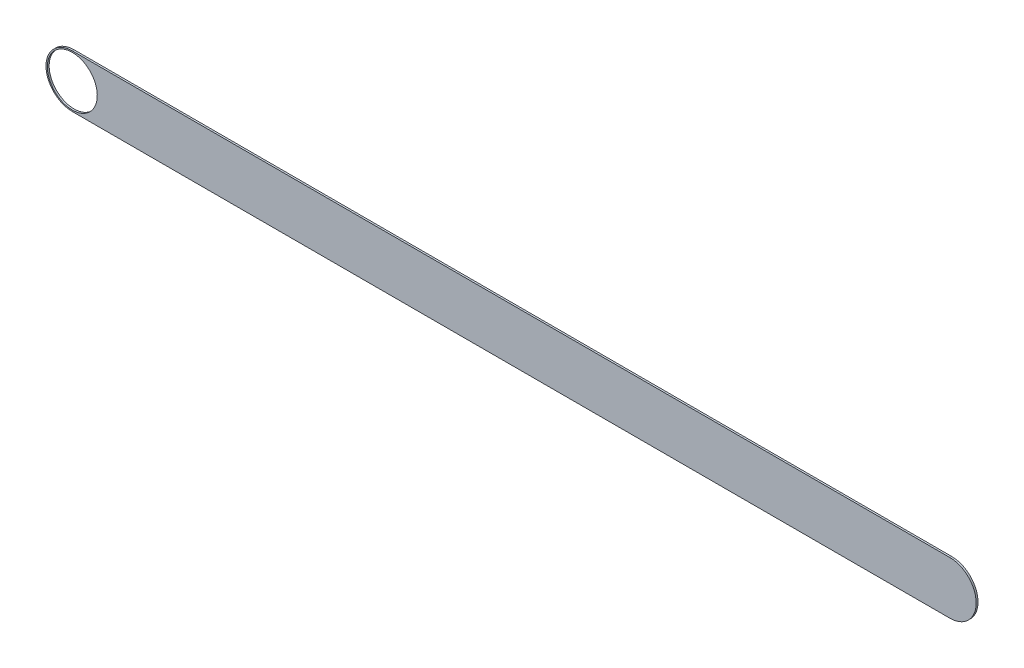
ISO-10303-21;
HEADER;
FILE_DESCRIPTION(('STEP AP214'),'2;1');
FILE_NAME('part.step','',(''),(''),'','','');
FILE_SCHEMA(('AUTOMOTIVE_DESIGN { 1 0 10303 214 1 1 1 1 }'));
ENDSEC;
DATA;
#1=APPLICATION_CONTEXT('core data for automotive mechanical design processes');
#2=APPLICATION_PROTOCOL_DEFINITION('international standard','automotive_design',2000,#1);
#3=PRODUCT_CONTEXT('',#1,'mechanical');
#4=PRODUCT('Part','Part','',(#3));
#5=PRODUCT_RELATED_PRODUCT_CATEGORY('part','',(#4));
#6=PRODUCT_DEFINITION_FORMATION('','',#4);
#7=PRODUCT_DEFINITION_CONTEXT('part definition',#1,'design');
#8=PRODUCT_DEFINITION('design','',#6,#7);
#9=PRODUCT_DEFINITION_SHAPE('','',#8);
#10=(LENGTH_UNIT() NAMED_UNIT(*) SI_UNIT(.MILLI.,.METRE.));
#11=(NAMED_UNIT(*) PLANE_ANGLE_UNIT() SI_UNIT($,.RADIAN.));
#12=(NAMED_UNIT(*) SI_UNIT($,.STERADIAN.) SOLID_ANGLE_UNIT());
#13=UNCERTAINTY_MEASURE_WITH_UNIT(LENGTH_MEASURE(1.E-05),#10,'distance_accuracy_value','');
#14=(GEOMETRIC_REPRESENTATION_CONTEXT(3) GLOBAL_UNCERTAINTY_ASSIGNED_CONTEXT((#13)) GLOBAL_UNIT_ASSIGNED_CONTEXT((#10,
#11,#12)) REPRESENTATION_CONTEXT('',''));
#15=CARTESIAN_POINT('',(0.,0.,0.));
#16=DIRECTION('',(0.,0.,1.));
#17=DIRECTION('',(1.,0.,0.));
#18=AXIS2_PLACEMENT_3D('',#15,#16,#17);
#19=CARTESIAN_POINT('',(80.,-94.796,-0.045));
#20=DIRECTION('',(0.,0.,-1.));
#21=DIRECTION('',(0.,-1.,0.));
#22=AXIS2_PLACEMENT_3D('',#19,#20,#21);
#23=CYLINDRICAL_SURFACE('',#22,0.475);
#24=CARTESIAN_POINT('',(80.,-94.796,1.6));
#25=DIRECTION('',(0.,0.,-1.));
#26=DIRECTION('',(0.,-1.,0.));
#27=AXIS2_PLACEMENT_3D('',#24,#25,#26);
#28=CIRCLE('',#27,0.475);
#29=CARTESIAN_POINT('',(80.,-95.271,1.6));
#30=VERTEX_POINT('',#29);
#31=EDGE_CURVE('E131',#30,#30,#28,.T.);
#32=ORIENTED_EDGE('',*,*,#31,.T.);
#33=DIRECTION('',(0.,0.,1.));
#34=VECTOR('',#33,1.);
#35=CARTESIAN_POINT('',(80.,-95.271,-0.045));
#36=LINE('',#35,#34);
#37=CARTESIAN_POINT('',(80.,-95.271,1.635));
#38=VERTEX_POINT('',#37);
#39=EDGE_CURVE('E11',#30,#38,#36,.T.);
#40=ORIENTED_EDGE('',*,*,#39,.T.);
#41=CARTESIAN_POINT('',(80.,-94.796,1.635));
#42=DIRECTION('',(0.,0.,-1.));
#43=DIRECTION('',(0.,-1.,0.));
#44=AXIS2_PLACEMENT_3D('',#41,#42,#43);
#45=CIRCLE('',#44,0.475);
#46=EDGE_CURVE('E20',#38,#38,#45,.T.);
#47=ORIENTED_EDGE('',*,*,#46,.F.);
#48=ORIENTED_EDGE('',*,*,#39,.F.);
#49=EDGE_LOOP('',(#32,#40,#47,#48));
#50=FACE_BOUND('',#49,.T.);
#51=ADVANCED_FACE('F17',(#50),#23,.F.);
#52=CARTESIAN_POINT('',(96.69,-94.296,1.6));
#53=DIRECTION('',(0.,-1.,0.));
#54=DIRECTION('',(0.,0.,-1.));
#55=AXIS2_PLACEMENT_3D('',#52,#53,#54);
#56=PLANE('',#55);
#57=DIRECTION('',(-1.,0.,0.));
#58=VECTOR('',#57,1.);
#59=CARTESIAN_POINT('',(96.69,-94.296,1.6));
#60=LINE('',#59,#58);
#61=CARTESIAN_POINT('',(96.69,-94.296,1.6));
#62=VERTEX_POINT('',#61);
#63=CARTESIAN_POINT('',(80.,-94.296,1.6));
#64=VERTEX_POINT('',#63);
#65=EDGE_CURVE('E128',#62,#64,#60,.T.);
#66=ORIENTED_EDGE('',*,*,#65,.T.);
#67=DIRECTION('',(0.,0.,1.));
#68=VECTOR('',#67,1.);
#69=CARTESIAN_POINT('',(80.,-94.296,1.6));
#70=LINE('',#69,#68);
#71=CARTESIAN_POINT('',(80.,-94.296,1.635));
#72=VERTEX_POINT('',#71);
#73=EDGE_CURVE('E84',#64,#72,#70,.T.);
#74=ORIENTED_EDGE('',*,*,#73,.T.);
#75=DIRECTION('',(-1.,0.,0.));
#76=VECTOR('',#75,1.);
#77=CARTESIAN_POINT('',(96.69,-94.296,1.635));
#78=LINE('',#77,#76);
#79=CARTESIAN_POINT('',(96.69,-94.296,1.635));
#80=VERTEX_POINT('',#79);
#81=EDGE_CURVE('E133',#80,#72,#78,.T.);
#82=ORIENTED_EDGE('',*,*,#81,.F.);
#83=DIRECTION('',(0.,0.,1.));
#84=VECTOR('',#83,1.);
#85=CARTESIAN_POINT('',(96.69,-94.296,1.6));
#86=LINE('',#85,#84);
#87=EDGE_CURVE('E120',#62,#80,#86,.T.);
#88=ORIENTED_EDGE('',*,*,#87,.F.);
#89=EDGE_LOOP('',(#66,#74,#82,#88));
#90=FACE_BOUND('',#89,.T.);
#91=ADVANCED_FACE('F145',(#90),#56,.F.);
#92=CARTESIAN_POINT('',(80.,-95.296,1.635));
#93=DIRECTION('',(0.,0.,1.));
#94=DIRECTION('',(1.,0.,0.));
#95=AXIS2_PLACEMENT_3D('',#92,#93,#94);
#96=PLANE('',#95);
#97=ORIENTED_EDGE('',*,*,#46,.T.);
#98=EDGE_LOOP('',(#97));
#99=FACE_BOUND('',#98,.T.);
#100=DIRECTION('',(1.,0.,0.));
#101=VECTOR('',#100,1.);
#102=CARTESIAN_POINT('',(80.,-95.296,1.635));
#103=LINE('',#102,#101);
#104=CARTESIAN_POINT('',(80.,-95.296,1.635));
#105=VERTEX_POINT('',#104);
#106=CARTESIAN_POINT('',(96.69,-95.296,1.635));
#107=VERTEX_POINT('',#106);
#108=EDGE_CURVE('E96',#105,#107,#103,.T.);
#109=ORIENTED_EDGE('',*,*,#108,.T.);
#110=CARTESIAN_POINT('',(96.69,-94.796,1.635));
#111=DIRECTION('',(0.,0.,1.));
#112=DIRECTION('',(0.,-1.,0.));
#113=AXIS2_PLACEMENT_3D('',#110,#111,#112);
#114=CIRCLE('',#113,0.5);
#115=EDGE_CURVE('E124',#107,#80,#114,.T.);
#116=ORIENTED_EDGE('',*,*,#115,.T.);
#117=ORIENTED_EDGE('',*,*,#81,.T.);
#118=CARTESIAN_POINT('',(80.,-94.796,1.635));
#119=DIRECTION('',(0.,0.,1.));
#120=DIRECTION('',(0.,1.,0.));
#121=AXIS2_PLACEMENT_3D('',#118,#119,#120);
#122=CIRCLE('',#121,0.5);
#123=EDGE_CURVE('E88',#72,#105,#122,.T.);
#124=ORIENTED_EDGE('',*,*,#123,.T.);
#125=EDGE_LOOP('',(#109,#116,#117,#124));
#126=FACE_BOUND('',#125,.T.);
#127=ADVANCED_FACE('F142',(#99,#126),#96,.T.);
#128=CARTESIAN_POINT('',(80.,-95.296,1.6));
#129=DIRECTION('',(0.,0.,1.));
#130=DIRECTION('',(1.,0.,0.));
#131=AXIS2_PLACEMENT_3D('',#128,#129,#130);
#132=PLANE('',#131);
#133=ORIENTED_EDGE('',*,*,#31,.F.);
#134=EDGE_LOOP('',(#133));
#135=FACE_BOUND('',#134,.T.);
#136=CARTESIAN_POINT('',(80.,-94.796,1.6));
#137=DIRECTION('',(0.,0.,1.));
#138=DIRECTION('',(0.,1.,0.));
#139=AXIS2_PLACEMENT_3D('',#136,#137,#138);
#140=CIRCLE('',#139,0.5);
#141=CARTESIAN_POINT('',(80.,-95.296,1.6));
#142=VERTEX_POINT('',#141);
#143=EDGE_CURVE('E77',#64,#142,#140,.T.);
#144=ORIENTED_EDGE('',*,*,#143,.F.);
#145=ORIENTED_EDGE('',*,*,#65,.F.);
#146=CARTESIAN_POINT('',(96.69,-94.796,1.6));
#147=DIRECTION('',(0.,0.,1.));
#148=DIRECTION('',(0.,-1.,0.));
#149=AXIS2_PLACEMENT_3D('',#146,#147,#148);
#150=CIRCLE('',#149,0.5);
#151=CARTESIAN_POINT('',(96.69,-95.296,1.6));
#152=VERTEX_POINT('',#151);
#153=EDGE_CURVE('E101',#152,#62,#150,.T.);
#154=ORIENTED_EDGE('',*,*,#153,.F.);
#155=DIRECTION('',(1.,0.,0.));
#156=VECTOR('',#155,1.);
#157=CARTESIAN_POINT('',(80.,-95.296,1.6));
#158=LINE('',#157,#156);
#159=EDGE_CURVE('E94',#142,#152,#158,.T.);
#160=ORIENTED_EDGE('',*,*,#159,.F.);
#161=EDGE_LOOP('',(#144,#145,#154,#160));
#162=FACE_BOUND('',#161,.T.);
#163=ADVANCED_FACE('F99',(#135,#162),#132,.F.);
#164=CARTESIAN_POINT('',(96.69,-94.796,1.6));
#165=DIRECTION('',(0.,0.,-1.));
#166=DIRECTION('',(0.,-1.,0.));
#167=AXIS2_PLACEMENT_3D('',#164,#165,#166);
#168=CYLINDRICAL_SURFACE('',#167,0.5);
#169=ORIENTED_EDGE('',*,*,#153,.T.);
#170=ORIENTED_EDGE('',*,*,#87,.T.);
#171=ORIENTED_EDGE('',*,*,#115,.F.);
#172=DIRECTION('',(0.,0.,1.));
#173=VECTOR('',#172,1.);
#174=CARTESIAN_POINT('',(96.69,-95.296,1.6));
#175=LINE('',#174,#173);
#176=EDGE_CURVE('E104',#152,#107,#175,.T.);
#177=ORIENTED_EDGE('',*,*,#176,.F.);
#178=EDGE_LOOP('',(#169,#170,#171,#177));
#179=FACE_BOUND('',#178,.T.);
#180=ADVANCED_FACE('F161',(#179),#168,.T.);
#181=CARTESIAN_POINT('',(80.,-94.796,1.6));
#182=DIRECTION('',(0.,0.,-1.));
#183=DIRECTION('',(0.,1.,0.));
#184=AXIS2_PLACEMENT_3D('',#181,#182,#183);
#185=CYLINDRICAL_SURFACE('',#184,0.5);
#186=ORIENTED_EDGE('',*,*,#143,.T.);
#187=DIRECTION('',(0.,0.,1.));
#188=VECTOR('',#187,1.);
#189=CARTESIAN_POINT('',(80.,-95.296,1.6));
#190=LINE('',#189,#188);
#191=EDGE_CURVE('E81',#142,#105,#190,.T.);
#192=ORIENTED_EDGE('',*,*,#191,.T.);
#193=ORIENTED_EDGE('',*,*,#123,.F.);
#194=ORIENTED_EDGE('',*,*,#73,.F.);
#195=EDGE_LOOP('',(#186,#192,#193,#194));
#196=FACE_BOUND('',#195,.T.);
#197=ADVANCED_FACE('F79',(#196),#185,.T.);
#198=CARTESIAN_POINT('',(80.,-95.296,1.6));
#199=DIRECTION('',(0.,1.,0.));
#200=DIRECTION('',(1.,0.,0.));
#201=AXIS2_PLACEMENT_3D('',#198,#199,#200);
#202=PLANE('',#201);
#203=ORIENTED_EDGE('',*,*,#159,.T.);
#204=ORIENTED_EDGE('',*,*,#176,.T.);
#205=ORIENTED_EDGE('',*,*,#108,.F.);
#206=ORIENTED_EDGE('',*,*,#191,.F.);
#207=EDGE_LOOP('',(#203,#204,#205,#206));
#208=FACE_BOUND('',#207,.T.);
#209=ADVANCED_FACE('F92',(#208),#202,.F.);
#210=CLOSED_SHELL('',(#51,#91,#127,#163,#180,#197,#209));
#211=MANIFOLD_SOLID_BREP('B1',#210);
#212=ADVANCED_BREP_SHAPE_REPRESENTATION('',(#18,#211),#14);
#213=SHAPE_DEFINITION_REPRESENTATION(#9,#212);
ENDSEC;
END-ISO-10303-21;
